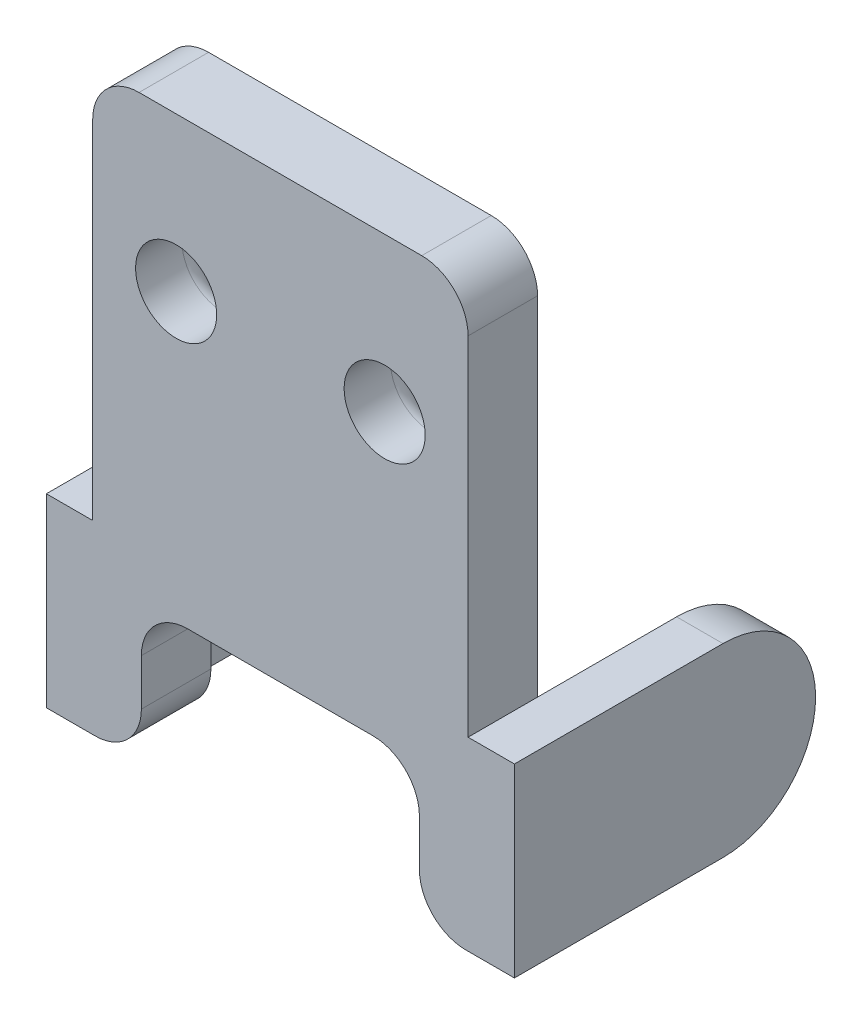
ISO-10303-21;
HEADER;
FILE_DESCRIPTION(('STEP AP214'),'2;1');
FILE_NAME('part.step','',(''),(''),'','','');
FILE_SCHEMA(('AUTOMOTIVE_DESIGN { 1 0 10303 214 1 1 1 1 }'));
ENDSEC;
DATA;
#1=APPLICATION_CONTEXT('core data for automotive mechanical design processes');
#2=APPLICATION_PROTOCOL_DEFINITION('international standard','automotive_design',2000,#1);
#3=PRODUCT_CONTEXT('',#1,'mechanical');
#4=PRODUCT('Part','Part','',(#3));
#5=PRODUCT_RELATED_PRODUCT_CATEGORY('part','',(#4));
#6=PRODUCT_DEFINITION_FORMATION('','',#4);
#7=PRODUCT_DEFINITION_CONTEXT('part definition',#1,'design');
#8=PRODUCT_DEFINITION('design','',#6,#7);
#9=PRODUCT_DEFINITION_SHAPE('','',#8);
#10=(LENGTH_UNIT() NAMED_UNIT(*) SI_UNIT(.MILLI.,.METRE.));
#11=(NAMED_UNIT(*) PLANE_ANGLE_UNIT() SI_UNIT($,.RADIAN.));
#12=(NAMED_UNIT(*) SI_UNIT($,.STERADIAN.) SOLID_ANGLE_UNIT());
#13=UNCERTAINTY_MEASURE_WITH_UNIT(LENGTH_MEASURE(1.E-05),#10,'distance_accuracy_value','');
#14=(GEOMETRIC_REPRESENTATION_CONTEXT(3) GLOBAL_UNCERTAINTY_ASSIGNED_CONTEXT((#13)) GLOBAL_UNIT_ASSIGNED_CONTEXT((#10,
#11,#12)) REPRESENTATION_CONTEXT('',''));
#15=CARTESIAN_POINT('',(0.,0.,0.));
#16=DIRECTION('',(0.,0.,1.));
#17=DIRECTION('',(1.,0.,0.));
#18=AXIS2_PLACEMENT_3D('',#15,#16,#17);
#19=CARTESIAN_POINT('',(0.,0.,3.));
#20=DIRECTION('',(0.,1.,0.));
#21=DIRECTION('',(0.,0.,1.));
#22=AXIS2_PLACEMENT_3D('',#19,#20,#21);
#23=PLANE('',#22);
#24=DIRECTION('',(1.,0.,0.));
#25=VECTOR('',#24,1.);
#26=CARTESIAN_POINT('',(0.,0.,3.));
#27=LINE('',#26,#25);
#28=CARTESIAN_POINT('',(16.1,0.,3.));
#29=VERTEX_POINT('',#28);
#30=CARTESIAN_POINT('',(18.2,0.,3.));
#31=VERTEX_POINT('',#30);
#32=EDGE_CURVE('E189',#29,#31,#27,.T.);
#33=ORIENTED_EDGE('',*,*,#32,.F.);
#34=DIRECTION('',(0.,0.,-1.));
#35=VECTOR('',#34,1.);
#36=CARTESIAN_POINT('',(16.1,0.,3.));
#37=LINE('',#36,#35);
#38=CARTESIAN_POINT('',(16.1,0.,0.));
#39=VERTEX_POINT('',#38);
#40=EDGE_CURVE('E340',#29,#39,#37,.T.);
#41=ORIENTED_EDGE('',*,*,#40,.T.);
#42=DIRECTION('',(1.,0.,0.));
#43=VECTOR('',#42,1.);
#44=CARTESIAN_POINT('',(0.,0.,0.));
#45=LINE('',#44,#43);
#46=CARTESIAN_POINT('',(16.2,0.,0.));
#47=VERTEX_POINT('',#46);
#48=EDGE_CURVE('E261',#39,#47,#45,.T.);
#49=ORIENTED_EDGE('',*,*,#48,.T.);
#50=DIRECTION('',(0.,0.,-1.));
#51=VECTOR('',#50,1.);
#52=CARTESIAN_POINT('',(16.2,0.,3.));
#53=LINE('',#52,#51);
#54=CARTESIAN_POINT('',(16.2,0.,-6.));
#55=VERTEX_POINT('',#54);
#56=EDGE_CURVE('E218',#47,#55,#53,.T.);
#57=ORIENTED_EDGE('',*,*,#56,.T.);
#58=DIRECTION('',(-1.,0.,0.));
#59=VECTOR('',#58,1.);
#60=CARTESIAN_POINT('',(0.,0.,-6.));
#61=LINE('',#60,#59);
#62=CARTESIAN_POINT('',(18.2,0.,-6.));
#63=VERTEX_POINT('',#62);
#64=EDGE_CURVE('E208',#55,#63,#61,.F.);
#65=ORIENTED_EDGE('',*,*,#64,.T.);
#66=DIRECTION('',(0.,0.,-1.));
#67=VECTOR('',#66,1.);
#68=CARTESIAN_POINT('',(18.2,0.,3.));
#69=LINE('',#68,#67);
#70=EDGE_CURVE('E205',#31,#63,#69,.T.);
#71=ORIENTED_EDGE('',*,*,#70,.F.);
#72=EDGE_LOOP('',(#33,#41,#49,#57,#65,#71));
#73=FACE_BOUND('',#72,.T.);
#74=ADVANCED_FACE('F33',(#73),#23,.F.);
#75=CARTESIAN_POINT('',(16.2,0.,3.));
#76=DIRECTION('',(-1.,0.,0.));
#77=DIRECTION('',(0.,0.,1.));
#78=AXIS2_PLACEMENT_3D('',#75,#76,#77);
#79=PLANE('',#78);
#80=DIRECTION('',(0.,1.,0.));
#81=VECTOR('',#80,1.);
#82=CARTESIAN_POINT('',(16.2,0.,0.));
#83=LINE('',#82,#81);
#84=CARTESIAN_POINT('',(16.2,8.,0.));
#85=VERTEX_POINT('',#84);
#86=CARTESIAN_POINT('',(16.2,23.,0.));
#87=VERTEX_POINT('',#86);
#88=EDGE_CURVE('E265',#85,#87,#83,.T.);
#89=ORIENTED_EDGE('',*,*,#88,.T.);
#90=DIRECTION('',(0.,0.,-1.));
#91=VECTOR('',#90,1.);
#92=CARTESIAN_POINT('',(16.2,23.,3.));
#93=LINE('',#92,#91);
#94=CARTESIAN_POINT('',(16.2,23.,3.));
#95=VERTEX_POINT('',#94);
#96=EDGE_CURVE('E11',#87,#95,#93,.F.);
#97=ORIENTED_EDGE('',*,*,#96,.T.);
#98=DIRECTION('',(0.,1.,0.));
#99=VECTOR('',#98,1.);
#100=CARTESIAN_POINT('',(16.2,0.,3.));
#101=LINE('',#100,#99);
#102=CARTESIAN_POINT('',(16.2,8.,3.));
#103=VERTEX_POINT('',#102);
#104=EDGE_CURVE('E254',#103,#95,#101,.T.);
#105=ORIENTED_EDGE('',*,*,#104,.F.);
#106=DIRECTION('',(0.,0.,1.));
#107=VECTOR('',#106,1.);
#108=CARTESIAN_POINT('',(16.2,8.,3.));
#109=LINE('',#108,#107);
#110=EDGE_CURVE('E220',#85,#103,#109,.T.);
#111=ORIENTED_EDGE('',*,*,#110,.F.);
#112=EDGE_LOOP('',(#89,#97,#105,#111));
#113=FACE_BOUND('',#112,.T.);
#114=ADVANCED_FACE('F383',(#113),#79,.F.);
#115=CARTESIAN_POINT('',(0.,0.,3.));
#116=DIRECTION('',(1.,0.,0.));
#117=DIRECTION('',(0.,0.,-1.));
#118=AXIS2_PLACEMENT_3D('',#115,#116,#117);
#119=PLANE('',#118);
#120=DIRECTION('',(0.,-1.,0.));
#121=VECTOR('',#120,1.);
#122=CARTESIAN_POINT('',(0.,0.,3.));
#123=LINE('',#122,#121);
#124=CARTESIAN_POINT('',(0.,23.,3.));
#125=VERTEX_POINT('',#124);
#126=CARTESIAN_POINT('',(0.,8.,3.));
#127=VERTEX_POINT('',#126);
#128=EDGE_CURVE('E202',#125,#127,#123,.T.);
#129=ORIENTED_EDGE('',*,*,#128,.F.);
#130=DIRECTION('',(0.,0.,-1.));
#131=VECTOR('',#130,1.);
#132=CARTESIAN_POINT('',(0.,23.,3.));
#133=LINE('',#132,#131);
#134=CARTESIAN_POINT('',(0.,23.,0.));
#135=VERTEX_POINT('',#134);
#136=EDGE_CURVE('E350',#125,#135,#133,.T.);
#137=ORIENTED_EDGE('',*,*,#136,.T.);
#138=DIRECTION('',(0.,-1.,0.));
#139=VECTOR('',#138,1.);
#140=CARTESIAN_POINT('',(0.,0.,0.));
#141=LINE('',#140,#139);
#142=CARTESIAN_POINT('',(0.,8.,0.));
#143=VERTEX_POINT('',#142);
#144=EDGE_CURVE('E259',#135,#143,#141,.T.);
#145=ORIENTED_EDGE('',*,*,#144,.T.);
#146=DIRECTION('',(0.,0.,-1.));
#147=VECTOR('',#146,1.);
#148=CARTESIAN_POINT('',(0.,8.,3.));
#149=LINE('',#148,#147);
#150=EDGE_CURVE('E244',#127,#143,#149,.T.);
#151=ORIENTED_EDGE('',*,*,#150,.F.);
#152=EDGE_LOOP('',(#129,#137,#145,#151));
#153=FACE_BOUND('',#152,.T.);
#154=ADVANCED_FACE('F369',(#153),#119,.F.);
#155=CARTESIAN_POINT('',(0.,0.,0.));
#156=VERTEX_POINT('',#155);
#157=CARTESIAN_POINT('',(0.0999999999999969,0.,0.));
#158=VERTEX_POINT('',#157);
#159=EDGE_CURVE('E262',#156,#158,#45,.T.);
#160=ORIENTED_EDGE('',*,*,#159,.T.);
#161=DIRECTION('',(0.,0.,-1.));
#162=VECTOR('',#161,1.);
#163=CARTESIAN_POINT('',(0.0999999999999969,0.,3.));
#164=LINE('',#163,#162);
#165=CARTESIAN_POINT('',(0.0999999999999969,0.,3.));
#166=VERTEX_POINT('',#165);
#167=EDGE_CURVE('E325',#158,#166,#164,.F.);
#168=ORIENTED_EDGE('',*,*,#167,.T.);
#169=CARTESIAN_POINT('',(-2.,0.,3.));
#170=VERTEX_POINT('',#169);
#171=EDGE_CURVE('E201',#170,#166,#27,.T.);
#172=ORIENTED_EDGE('',*,*,#171,.F.);
#173=DIRECTION('',(0.,0.,1.));
#174=VECTOR('',#173,1.);
#175=CARTESIAN_POINT('',(-2.,0.,3.));
#176=LINE('',#175,#174);
#177=CARTESIAN_POINT('',(-2.,0.,-6.));
#178=VERTEX_POINT('',#177);
#179=EDGE_CURVE('E241',#178,#170,#176,.T.);
#180=ORIENTED_EDGE('',*,*,#179,.F.);
#181=DIRECTION('',(1.,0.,0.));
#182=VECTOR('',#181,1.);
#183=CARTESIAN_POINT('',(0.,0.,-6.));
#184=LINE('',#183,#182);
#185=CARTESIAN_POINT('',(0.,0.,-6.));
#186=VERTEX_POINT('',#185);
#187=EDGE_CURVE('E295',#178,#186,#184,.T.);
#188=ORIENTED_EDGE('',*,*,#187,.T.);
#189=DIRECTION('',(0.,0.,1.));
#190=VECTOR('',#189,1.);
#191=CARTESIAN_POINT('',(0.,0.,3.));
#192=LINE('',#191,#190);
#193=EDGE_CURVE('E238',#186,#156,#192,.T.);
#194=ORIENTED_EDGE('',*,*,#193,.T.);
#195=EDGE_LOOP('',(#160,#168,#172,#180,#188,#194));
#196=FACE_BOUND('',#195,.T.);
#197=ADVANCED_FACE('F441',(#196),#23,.F.);
#198=CARTESIAN_POINT('',(0.,25.,3.));
#199=DIRECTION('',(0.,-1.,0.));
#200=DIRECTION('',(0.,0.,-1.));
#201=AXIS2_PLACEMENT_3D('',#198,#199,#200);
#202=PLANE('',#201);
#203=DIRECTION('',(-1.,0.,0.));
#204=VECTOR('',#203,1.);
#205=CARTESIAN_POINT('',(0.,25.,0.));
#206=LINE('',#205,#204);
#207=CARTESIAN_POINT('',(14.2,25.,0.));
#208=VERTEX_POINT('',#207);
#209=CARTESIAN_POINT('',(2.,25.,0.));
#210=VERTEX_POINT('',#209);
#211=EDGE_CURVE('E251',#208,#210,#206,.T.);
#212=ORIENTED_EDGE('',*,*,#211,.T.);
#213=DIRECTION('',(0.,0.,-1.));
#214=VECTOR('',#213,1.);
#215=CARTESIAN_POINT('',(2.,25.,3.));
#216=LINE('',#215,#214);
#217=CARTESIAN_POINT('',(2.,25.,3.));
#218=VERTEX_POINT('',#217);
#219=EDGE_CURVE('E54',#210,#218,#216,.F.);
#220=ORIENTED_EDGE('',*,*,#219,.T.);
#221=DIRECTION('',(-1.,0.,0.));
#222=VECTOR('',#221,1.);
#223=CARTESIAN_POINT('',(0.,25.,3.));
#224=LINE('',#223,#222);
#225=CARTESIAN_POINT('',(14.2,25.,3.));
#226=VERTEX_POINT('',#225);
#227=EDGE_CURVE('E256',#226,#218,#224,.T.);
#228=ORIENTED_EDGE('',*,*,#227,.F.);
#229=DIRECTION('',(0.,0.,-1.));
#230=VECTOR('',#229,1.);
#231=CARTESIAN_POINT('',(14.2,25.,3.));
#232=LINE('',#231,#230);
#233=EDGE_CURVE('E357',#226,#208,#232,.T.);
#234=ORIENTED_EDGE('',*,*,#233,.T.);
#235=EDGE_LOOP('',(#212,#220,#228,#234));
#236=FACE_BOUND('',#235,.T.);
#237=ADVANCED_FACE('F376',(#236),#202,.F.);
#238=CARTESIAN_POINT('',(0.,0.,3.));
#239=DIRECTION('',(0.,0.,-1.));
#240=DIRECTION('',(-1.,0.,0.));
#241=AXIS2_PLACEMENT_3D('',#238,#239,#240);
#242=PLANE('',#241);
#243=CARTESIAN_POINT('',(3.6,18.360124913352,3.));
#244=DIRECTION('',(0.,0.,-1.));
#245=DIRECTION('',(-1.,0.,0.));
#246=AXIS2_PLACEMENT_3D('',#243,#244,#245);
#247=CIRCLE('',#246,1.75);
#248=CARTESIAN_POINT('',(1.85,18.360124913352,3.));
#249=VERTEX_POINT('',#248);
#250=EDGE_CURVE('E313',#249,#249,#247,.F.);
#251=ORIENTED_EDGE('',*,*,#250,.F.);
#252=EDGE_LOOP('',(#251));
#253=FACE_BOUND('',#252,.T.);
#254=CARTESIAN_POINT('',(12.6,18.360124913352,3.));
#255=DIRECTION('',(0.,0.,-1.));
#256=DIRECTION('',(-1.,0.,0.));
#257=AXIS2_PLACEMENT_3D('',#254,#255,#256);
#258=CIRCLE('',#257,1.75);
#259=CARTESIAN_POINT('',(10.85,18.360124913352,3.));
#260=VERTEX_POINT('',#259);
#261=EDGE_CURVE('E471',#260,#260,#258,.F.);
#262=ORIENTED_EDGE('',*,*,#261,.F.);
#263=EDGE_LOOP('',(#262));
#264=FACE_BOUND('',#263,.T.);
#265=ORIENTED_EDGE('',*,*,#227,.T.);
#266=CARTESIAN_POINT('',(2.,23.,3.));
#267=DIRECTION('',(0.,0.,-1.));
#268=DIRECTION('',(-1.,0.,0.));
#269=AXIS2_PLACEMENT_3D('',#266,#267,#268);
#270=CIRCLE('',#269,2.);
#271=EDGE_CURVE('E41',#218,#125,#270,.F.);
#272=ORIENTED_EDGE('',*,*,#271,.T.);
#273=ORIENTED_EDGE('',*,*,#128,.T.);
#274=DIRECTION('',(1.,0.,0.));
#275=VECTOR('',#274,1.);
#276=CARTESIAN_POINT('',(-2.,8.,3.));
#277=LINE('',#276,#275);
#278=CARTESIAN_POINT('',(-2.,8.,3.));
#279=VERTEX_POINT('',#278);
#280=EDGE_CURVE('E243',#279,#127,#277,.T.);
#281=ORIENTED_EDGE('',*,*,#280,.F.);
#282=DIRECTION('',(0.,1.,0.));
#283=VECTOR('',#282,1.);
#284=CARTESIAN_POINT('',(-2.,0.,3.));
#285=LINE('',#284,#283);
#286=EDGE_CURVE('E234',#170,#279,#285,.T.);
#287=ORIENTED_EDGE('',*,*,#286,.F.);
#288=ORIENTED_EDGE('',*,*,#171,.T.);
#289=CARTESIAN_POINT('',(0.0999999999999969,2.,3.));
#290=DIRECTION('',(0.,0.,-1.));
#291=DIRECTION('',(-1.,0.,0.));
#292=AXIS2_PLACEMENT_3D('',#289,#290,#291);
#293=CIRCLE('',#292,2.);
#294=CARTESIAN_POINT('',(2.1,2.,3.));
#295=VERTEX_POINT('',#294);
#296=EDGE_CURVE('E328',#166,#295,#293,.F.);
#297=ORIENTED_EDGE('',*,*,#296,.T.);
#298=DIRECTION('',(0.,-1.,0.));
#299=VECTOR('',#298,1.);
#300=CARTESIAN_POINT('',(2.1,0.,3.));
#301=LINE('',#300,#299);
#302=CARTESIAN_POINT('',(2.09999999999999,4.,3.));
#303=VERTEX_POINT('',#302);
#304=EDGE_CURVE('E412',#303,#295,#301,.T.);
#305=ORIENTED_EDGE('',*,*,#304,.F.);
#306=CARTESIAN_POINT('',(4.1,4.,3.));
#307=DIRECTION('',(0.,0.,-1.));
#308=DIRECTION('',(-1.,0.,0.));
#309=AXIS2_PLACEMENT_3D('',#306,#307,#308);
#310=CIRCLE('',#309,2.);
#311=CARTESIAN_POINT('',(4.1,6.,3.));
#312=VERTEX_POINT('',#311);
#313=EDGE_CURVE('E344',#303,#312,#310,.T.);
#314=ORIENTED_EDGE('',*,*,#313,.T.);
#315=DIRECTION('',(-1.,0.,0.));
#316=VECTOR('',#315,1.);
#317=CARTESIAN_POINT('',(14.1,6.,3.));
#318=LINE('',#317,#316);
#319=CARTESIAN_POINT('',(12.1,6.,3.));
#320=VERTEX_POINT('',#319);
#321=EDGE_CURVE('E407',#320,#312,#318,.T.);
#322=ORIENTED_EDGE('',*,*,#321,.F.);
#323=CARTESIAN_POINT('',(12.1,4.,3.));
#324=DIRECTION('',(0.,0.,-1.));
#325=DIRECTION('',(-1.,0.,0.));
#326=AXIS2_PLACEMENT_3D('',#323,#324,#325);
#327=CIRCLE('',#326,2.);
#328=CARTESIAN_POINT('',(14.1,4.,3.));
#329=VERTEX_POINT('',#328);
#330=EDGE_CURVE('E348',#320,#329,#327,.T.);
#331=ORIENTED_EDGE('',*,*,#330,.T.);
#332=DIRECTION('',(0.,1.,0.));
#333=VECTOR('',#332,1.);
#334=CARTESIAN_POINT('',(14.1,0.,3.));
#335=LINE('',#334,#333);
#336=CARTESIAN_POINT('',(14.1,2.,3.));
#337=VERTEX_POINT('',#336);
#338=EDGE_CURVE('E402',#337,#329,#335,.T.);
#339=ORIENTED_EDGE('',*,*,#338,.F.);
#340=CARTESIAN_POINT('',(16.1,2.,3.));
#341=DIRECTION('',(0.,0.,-1.));
#342=DIRECTION('',(-1.,0.,0.));
#343=AXIS2_PLACEMENT_3D('',#340,#341,#342);
#344=CIRCLE('',#343,2.);
#345=EDGE_CURVE('E197',#337,#29,#344,.F.);
#346=ORIENTED_EDGE('',*,*,#345,.T.);
#347=ORIENTED_EDGE('',*,*,#32,.T.);
#348=DIRECTION('',(0.,-1.,0.));
#349=VECTOR('',#348,1.);
#350=CARTESIAN_POINT('',(18.2,0.,3.));
#351=LINE('',#350,#349);
#352=CARTESIAN_POINT('',(18.2,8.,3.));
#353=VERTEX_POINT('',#352);
#354=EDGE_CURVE('E194',#353,#31,#351,.T.);
#355=ORIENTED_EDGE('',*,*,#354,.F.);
#356=DIRECTION('',(-1.,0.,0.));
#357=VECTOR('',#356,1.);
#358=CARTESIAN_POINT('',(18.2,8.,3.));
#359=LINE('',#358,#357);
#360=EDGE_CURVE('E226',#353,#103,#359,.T.);
#361=ORIENTED_EDGE('',*,*,#360,.T.);
#362=ORIENTED_EDGE('',*,*,#104,.T.);
#363=CARTESIAN_POINT('',(14.2,23.,3.));
#364=DIRECTION('',(0.,0.,-1.));
#365=DIRECTION('',(-1.,0.,0.));
#366=AXIS2_PLACEMENT_3D('',#363,#364,#365);
#367=CIRCLE('',#366,2.);
#368=EDGE_CURVE('E361',#95,#226,#367,.F.);
#369=ORIENTED_EDGE('',*,*,#368,.T.);
#370=EDGE_LOOP('',(#265,#272,#273,#281,#287,#288,#297,#305,#314,#322,#331,#339,#346,#347,#355,
#361,#362,#369));
#371=FACE_BOUND('',#370,.T.);
#372=ADVANCED_FACE('F191',(#253,#264,#371),#242,.F.);
#373=CARTESIAN_POINT('',(0.,0.,0.));
#374=DIRECTION('',(0.,0.,-1.));
#375=DIRECTION('',(-1.,0.,0.));
#376=AXIS2_PLACEMENT_3D('',#373,#374,#375);
#377=PLANE('',#376);
#378=CARTESIAN_POINT('',(3.6,18.360124913352,0.));
#379=DIRECTION('',(0.,0.,-1.));
#380=DIRECTION('',(-1.,0.,0.));
#381=AXIS2_PLACEMENT_3D('',#378,#379,#380);
#382=CIRCLE('',#381,2.75);
#383=CARTESIAN_POINT('',(0.849999999999998,18.360124913352,0.));
#384=VERTEX_POINT('',#383);
#385=EDGE_CURVE('E278',#384,#384,#382,.F.);
#386=ORIENTED_EDGE('',*,*,#385,.T.);
#387=EDGE_LOOP('',(#386));
#388=FACE_BOUND('',#387,.T.);
#389=CARTESIAN_POINT('',(12.6,18.360124913352,0.));
#390=DIRECTION('',(0.,0.,-1.));
#391=DIRECTION('',(-1.,0.,0.));
#392=AXIS2_PLACEMENT_3D('',#389,#390,#391);
#393=CIRCLE('',#392,2.75);
#394=CARTESIAN_POINT('',(9.85,18.360124913352,0.));
#395=VERTEX_POINT('',#394);
#396=EDGE_CURVE('E275',#395,#395,#393,.F.);
#397=ORIENTED_EDGE('',*,*,#396,.T.);
#398=EDGE_LOOP('',(#397));
#399=FACE_BOUND('',#398,.T.);
#400=ORIENTED_EDGE('',*,*,#144,.F.);
#401=CARTESIAN_POINT('',(2.,23.,0.));
#402=DIRECTION('',(0.,0.,-1.));
#403=DIRECTION('',(-1.,0.,0.));
#404=AXIS2_PLACEMENT_3D('',#401,#402,#403);
#405=CIRCLE('',#404,2.);
#406=EDGE_CURVE('E355',#135,#210,#405,.T.);
#407=ORIENTED_EDGE('',*,*,#406,.T.);
#408=ORIENTED_EDGE('',*,*,#211,.F.);
#409=CARTESIAN_POINT('',(14.2,23.,0.));
#410=DIRECTION('',(0.,0.,-1.));
#411=DIRECTION('',(-1.,0.,0.));
#412=AXIS2_PLACEMENT_3D('',#409,#410,#411);
#413=CIRCLE('',#412,2.);
#414=EDGE_CURVE('E353',#208,#87,#413,.T.);
#415=ORIENTED_EDGE('',*,*,#414,.T.);
#416=ORIENTED_EDGE('',*,*,#88,.F.);
#417=EDGE_CURVE('E266',#47,#85,#83,.T.);
#418=ORIENTED_EDGE('',*,*,#417,.F.);
#419=ORIENTED_EDGE('',*,*,#48,.F.);
#420=CARTESIAN_POINT('',(16.1,2.,0.));
#421=DIRECTION('',(0.,0.,-1.));
#422=DIRECTION('',(-1.,0.,0.));
#423=AXIS2_PLACEMENT_3D('',#420,#421,#422);
#424=CIRCLE('',#423,2.);
#425=CARTESIAN_POINT('',(14.1,2.,0.));
#426=VERTEX_POINT('',#425);
#427=EDGE_CURVE('E321',#39,#426,#424,.T.);
#428=ORIENTED_EDGE('',*,*,#427,.T.);
#429=DIRECTION('',(0.,-1.,0.));
#430=VECTOR('',#429,1.);
#431=CARTESIAN_POINT('',(14.1,0.,0.));
#432=LINE('',#431,#430);
#433=CARTESIAN_POINT('',(14.1,4.,0.));
#434=VERTEX_POINT('',#433);
#435=EDGE_CURVE('E404',#434,#426,#432,.T.);
#436=ORIENTED_EDGE('',*,*,#435,.F.);
#437=CARTESIAN_POINT('',(12.1,4.,0.));
#438=DIRECTION('',(0.,0.,-1.));
#439=DIRECTION('',(-1.,0.,0.));
#440=AXIS2_PLACEMENT_3D('',#437,#438,#439);
#441=CIRCLE('',#440,2.);
#442=CARTESIAN_POINT('',(12.1,6.,0.));
#443=VERTEX_POINT('',#442);
#444=EDGE_CURVE('E346',#434,#443,#441,.F.);
#445=ORIENTED_EDGE('',*,*,#444,.T.);
#446=DIRECTION('',(1.,0.,0.));
#447=VECTOR('',#446,1.);
#448=CARTESIAN_POINT('',(14.1,6.,0.));
#449=LINE('',#448,#447);
#450=CARTESIAN_POINT('',(4.1,6.,0.));
#451=VERTEX_POINT('',#450);
#452=EDGE_CURVE('E418',#451,#443,#449,.T.);
#453=ORIENTED_EDGE('',*,*,#452,.F.);
#454=CARTESIAN_POINT('',(4.1,4.,0.));
#455=DIRECTION('',(0.,0.,-1.));
#456=DIRECTION('',(-1.,0.,0.));
#457=AXIS2_PLACEMENT_3D('',#454,#455,#456);
#458=CIRCLE('',#457,2.);
#459=CARTESIAN_POINT('',(2.09999999999999,4.,0.));
#460=VERTEX_POINT('',#459);
#461=EDGE_CURVE('E342',#451,#460,#458,.F.);
#462=ORIENTED_EDGE('',*,*,#461,.T.);
#463=DIRECTION('',(0.,1.,0.));
#464=VECTOR('',#463,1.);
#465=CARTESIAN_POINT('',(2.1,0.,0.));
#466=LINE('',#465,#464);
#467=CARTESIAN_POINT('',(2.1,2.,0.));
#468=VERTEX_POINT('',#467);
#469=EDGE_CURVE('E409',#468,#460,#466,.T.);
#470=ORIENTED_EDGE('',*,*,#469,.F.);
#471=CARTESIAN_POINT('',(0.0999999999999969,2.,0.));
#472=DIRECTION('',(0.,0.,-1.));
#473=DIRECTION('',(-1.,0.,0.));
#474=AXIS2_PLACEMENT_3D('',#471,#472,#473);
#475=CIRCLE('',#474,2.);
#476=EDGE_CURVE('E323',#468,#158,#475,.T.);
#477=ORIENTED_EDGE('',*,*,#476,.T.);
#478=ORIENTED_EDGE('',*,*,#159,.F.);
#479=EDGE_CURVE('E250',#143,#156,#141,.T.);
#480=ORIENTED_EDGE('',*,*,#479,.F.);
#481=EDGE_LOOP('',(#400,#407,#408,#415,#416,#418,#419,#428,#436,#445,#453,#462,#470,#477,#478,#480));
#482=FACE_BOUND('',#481,.T.);
#483=ADVANCED_FACE('F374',(#388,#399,#482),#377,.T.);
#484=CARTESIAN_POINT('',(0.,0.,0.));
#485=DIRECTION('',(-1.,0.,0.));
#486=DIRECTION('',(0.,0.,1.));
#487=AXIS2_PLACEMENT_3D('',#484,#485,#486);
#488=PLANE('',#487);
#489=CARTESIAN_POINT('',(0.,4.03577497147012,-7.));
#490=DIRECTION('',(-1.,0.,0.));
#491=DIRECTION('',(0.,0.,1.));
#492=AXIS2_PLACEMENT_3D('',#489,#490,#491);
#493=CIRCLE('',#492,1.8);
#494=CARTESIAN_POINT('',(0.,4.03577497147012,-5.2));
#495=VERTEX_POINT('',#494);
#496=EDGE_CURVE('E258',#495,#495,#493,.F.);
#497=ORIENTED_EDGE('',*,*,#496,.F.);
#498=EDGE_LOOP('',(#497));
#499=FACE_BOUND('',#498,.T.);
#500=CARTESIAN_POINT('',(0.,4.,-6.));
#501=DIRECTION('',(-1.,0.,0.));
#502=DIRECTION('',(0.,0.,1.));
#503=AXIS2_PLACEMENT_3D('',#500,#501,#502);
#504=CIRCLE('',#503,4.);
#505=CARTESIAN_POINT('',(0.,4.,-10.));
#506=VERTEX_POINT('',#505);
#507=EDGE_CURVE('E284',#186,#506,#504,.F.);
#508=ORIENTED_EDGE('',*,*,#507,.T.);
#509=CARTESIAN_POINT('',(0.,4.,-6.));
#510=DIRECTION('',(-1.,0.,0.));
#511=DIRECTION('',(0.,0.,1.));
#512=AXIS2_PLACEMENT_3D('',#509,#510,#511);
#513=CIRCLE('',#512,4.);
#514=CARTESIAN_POINT('',(0.,8.,-6.));
#515=VERTEX_POINT('',#514);
#516=EDGE_CURVE('E286',#506,#515,#513,.F.);
#517=ORIENTED_EDGE('',*,*,#516,.T.);
#518=EDGE_CURVE('E233',#143,#515,#149,.T.);
#519=ORIENTED_EDGE('',*,*,#518,.F.);
#520=ORIENTED_EDGE('',*,*,#479,.T.);
#521=ORIENTED_EDGE('',*,*,#193,.F.);
#522=EDGE_LOOP('',(#508,#517,#519,#520,#521));
#523=FACE_BOUND('',#522,.T.);
#524=ADVANCED_FACE('F603',(#499,#523),#488,.F.);
#525=CARTESIAN_POINT('',(-2.,8.,3.));
#526=DIRECTION('',(0.,-1.,0.));
#527=DIRECTION('',(0.,0.,-1.));
#528=AXIS2_PLACEMENT_3D('',#525,#526,#527);
#529=PLANE('',#528);
#530=ORIENTED_EDGE('',*,*,#518,.T.);
#531=DIRECTION('',(1.,0.,0.));
#532=VECTOR('',#531,1.);
#533=CARTESIAN_POINT('',(-2.,8.,-6.));
#534=LINE('',#533,#532);
#535=CARTESIAN_POINT('',(-2.,8.,-6.));
#536=VERTEX_POINT('',#535);
#537=EDGE_CURVE('E288',#515,#536,#534,.F.);
#538=ORIENTED_EDGE('',*,*,#537,.T.);
#539=DIRECTION('',(0.,0.,-1.));
#540=VECTOR('',#539,1.);
#541=CARTESIAN_POINT('',(-2.,8.,3.));
#542=LINE('',#541,#540);
#543=EDGE_CURVE('E237',#279,#536,#542,.T.);
#544=ORIENTED_EDGE('',*,*,#543,.F.);
#545=ORIENTED_EDGE('',*,*,#280,.T.);
#546=ORIENTED_EDGE('',*,*,#150,.T.);
#547=EDGE_LOOP('',(#530,#538,#544,#545,#546));
#548=FACE_BOUND('',#547,.T.);
#549=ADVANCED_FACE('F697',(#548),#529,.F.);
#550=CARTESIAN_POINT('',(-2.,0.,0.));
#551=DIRECTION('',(-1.,0.,0.));
#552=DIRECTION('',(0.,0.,1.));
#553=AXIS2_PLACEMENT_3D('',#550,#551,#552);
#554=PLANE('',#553);
#555=ORIENTED_EDGE('',*,*,#543,.T.);
#556=CARTESIAN_POINT('',(-2.,4.,-6.));
#557=DIRECTION('',(-1.,0.,0.));
#558=DIRECTION('',(0.,0.,1.));
#559=AXIS2_PLACEMENT_3D('',#556,#557,#558);
#560=CIRCLE('',#559,4.);
#561=CARTESIAN_POINT('',(-2.,4.,-10.));
#562=VERTEX_POINT('',#561);
#563=EDGE_CURVE('E293',#536,#562,#560,.T.);
#564=ORIENTED_EDGE('',*,*,#563,.T.);
#565=CARTESIAN_POINT('',(-2.,4.,-6.));
#566=DIRECTION('',(-1.,0.,0.));
#567=DIRECTION('',(0.,0.,1.));
#568=AXIS2_PLACEMENT_3D('',#565,#566,#567);
#569=CIRCLE('',#568,4.);
#570=EDGE_CURVE('E291',#562,#178,#569,.T.);
#571=ORIENTED_EDGE('',*,*,#570,.T.);
#572=ORIENTED_EDGE('',*,*,#179,.T.);
#573=ORIENTED_EDGE('',*,*,#286,.T.);
#574=EDGE_LOOP('',(#555,#564,#571,#572,#573));
#575=FACE_BOUND('',#574,.T.);
#576=ADVANCED_FACE('F706',(#575),#554,.T.);
#577=CARTESIAN_POINT('',(1.5,4.03577497147012,-7.));
#578=DIRECTION('',(-1.,0.,0.));
#579=DIRECTION('',(0.,0.,1.));
#580=AXIS2_PLACEMENT_3D('',#577,#578,#579);
#581=CYLINDRICAL_SURFACE('',#580,1.8);
#582=CARTESIAN_POINT('',(1.5,4.03577497147012,-7.));
#583=DIRECTION('',(1.,0.,0.));
#584=DIRECTION('',(0.,0.,-1.));
#585=AXIS2_PLACEMENT_3D('',#582,#583,#584);
#586=CIRCLE('',#585,1.8);
#587=CARTESIAN_POINT('',(1.5,4.03577497147012,-8.8));
#588=VERTEX_POINT('',#587);
#589=EDGE_CURVE('E230',#588,#588,#586,.T.);
#590=ORIENTED_EDGE('',*,*,#589,.F.);
#591=EDGE_LOOP('',(#590));
#592=FACE_BOUND('',#591,.T.);
#593=ORIENTED_EDGE('',*,*,#496,.T.);
#594=EDGE_LOOP('',(#593));
#595=FACE_BOUND('',#594,.T.);
#596=ADVANCED_FACE('F715',(#592,#595),#581,.T.);
#597=CARTESIAN_POINT('',(1.5,4.03577497147012,-7.));
#598=DIRECTION('',(1.,0.,0.));
#599=DIRECTION('',(0.,0.,-1.));
#600=AXIS2_PLACEMENT_3D('',#597,#598,#599);
#601=PLANE('',#600);
#602=ORIENTED_EDGE('',*,*,#589,.T.);
#603=EDGE_LOOP('',(#602));
#604=FACE_BOUND('',#603,.T.);
#605=ADVANCED_FACE('F724',(#604),#601,.T.);
#606=CARTESIAN_POINT('',(18.2,8.,3.));
#607=DIRECTION('',(0.,-1.,0.));
#608=DIRECTION('',(0.,0.,-1.));
#609=AXIS2_PLACEMENT_3D('',#606,#607,#608);
#610=PLANE('',#609);
#611=DIRECTION('',(0.,0.,1.));
#612=VECTOR('',#611,1.);
#613=CARTESIAN_POINT('',(18.2,8.,3.));
#614=LINE('',#613,#612);
#615=CARTESIAN_POINT('',(18.2,8.,-6.));
#616=VERTEX_POINT('',#615);
#617=EDGE_CURVE('E211',#616,#353,#614,.T.);
#618=ORIENTED_EDGE('',*,*,#617,.F.);
#619=DIRECTION('',(-1.,0.,0.));
#620=VECTOR('',#619,1.);
#621=CARTESIAN_POINT('',(18.2,8.,-6.));
#622=LINE('',#621,#620);
#623=CARTESIAN_POINT('',(16.2,8.,-6.));
#624=VERTEX_POINT('',#623);
#625=EDGE_CURVE('E297',#616,#624,#622,.T.);
#626=ORIENTED_EDGE('',*,*,#625,.T.);
#627=EDGE_CURVE('E216',#624,#85,#109,.T.);
#628=ORIENTED_EDGE('',*,*,#627,.T.);
#629=ORIENTED_EDGE('',*,*,#110,.T.);
#630=ORIENTED_EDGE('',*,*,#360,.F.);
#631=EDGE_LOOP('',(#618,#626,#628,#629,#630));
#632=FACE_BOUND('',#631,.T.);
#633=ADVANCED_FACE('F386',(#632),#610,.F.);
#634=CARTESIAN_POINT('',(18.2,0.,0.));
#635=DIRECTION('',(-1.,0.,0.));
#636=DIRECTION('',(0.,0.,1.));
#637=AXIS2_PLACEMENT_3D('',#634,#635,#636);
#638=PLANE('',#637);
#639=CARTESIAN_POINT('',(18.2,4.,-6.));
#640=DIRECTION('',(-1.,0.,0.));
#641=DIRECTION('',(0.,0.,1.));
#642=AXIS2_PLACEMENT_3D('',#639,#640,#641);
#643=CIRCLE('',#642,4.);
#644=CARTESIAN_POINT('',(18.2,4.,-10.));
#645=VERTEX_POINT('',#644);
#646=EDGE_CURVE('E304',#63,#645,#643,.F.);
#647=ORIENTED_EDGE('',*,*,#646,.T.);
#648=CARTESIAN_POINT('',(18.2,4.,-6.));
#649=DIRECTION('',(-1.,0.,0.));
#650=DIRECTION('',(0.,0.,1.));
#651=AXIS2_PLACEMENT_3D('',#648,#649,#650);
#652=CIRCLE('',#651,4.);
#653=EDGE_CURVE('E306',#645,#616,#652,.F.);
#654=ORIENTED_EDGE('',*,*,#653,.T.);
#655=ORIENTED_EDGE('',*,*,#617,.T.);
#656=ORIENTED_EDGE('',*,*,#354,.T.);
#657=ORIENTED_EDGE('',*,*,#70,.T.);
#658=EDGE_LOOP('',(#647,#654,#655,#656,#657));
#659=FACE_BOUND('',#658,.T.);
#660=ADVANCED_FACE('F213',(#659),#638,.F.);
#661=CARTESIAN_POINT('',(16.2,0.,0.));
#662=DIRECTION('',(-1.,0.,0.));
#663=DIRECTION('',(0.,0.,1.));
#664=AXIS2_PLACEMENT_3D('',#661,#662,#663);
#665=PLANE('',#664);
#666=CARTESIAN_POINT('',(16.2,3.87973122911944,-7.));
#667=DIRECTION('',(-1.,0.,0.));
#668=DIRECTION('',(0.,0.,1.));
#669=AXIS2_PLACEMENT_3D('',#666,#667,#668);
#670=CIRCLE('',#669,1.8);
#671=CARTESIAN_POINT('',(16.2,3.87973122911944,-5.2));
#672=VERTEX_POINT('',#671);
#673=EDGE_CURVE('E222',#672,#672,#670,.T.);
#674=ORIENTED_EDGE('',*,*,#673,.F.);
#675=EDGE_LOOP('',(#674));
#676=FACE_BOUND('',#675,.T.);
#677=ORIENTED_EDGE('',*,*,#627,.F.);
#678=CARTESIAN_POINT('',(16.2,4.,-6.));
#679=DIRECTION('',(-1.,0.,0.));
#680=DIRECTION('',(0.,0.,1.));
#681=AXIS2_PLACEMENT_3D('',#678,#679,#680);
#682=CIRCLE('',#681,4.);
#683=CARTESIAN_POINT('',(16.2,4.,-10.));
#684=VERTEX_POINT('',#683);
#685=EDGE_CURVE('E302',#624,#684,#682,.T.);
#686=ORIENTED_EDGE('',*,*,#685,.T.);
#687=CARTESIAN_POINT('',(16.2,4.,-6.));
#688=DIRECTION('',(-1.,0.,0.));
#689=DIRECTION('',(0.,0.,1.));
#690=AXIS2_PLACEMENT_3D('',#687,#688,#689);
#691=CIRCLE('',#690,4.);
#692=EDGE_CURVE('E300',#684,#55,#691,.T.);
#693=ORIENTED_EDGE('',*,*,#692,.T.);
#694=ORIENTED_EDGE('',*,*,#56,.F.);
#695=ORIENTED_EDGE('',*,*,#417,.T.);
#696=EDGE_LOOP('',(#677,#686,#693,#694,#695));
#697=FACE_BOUND('',#696,.T.);
#698=ADVANCED_FACE('F390',(#676,#697),#665,.T.);
#699=CARTESIAN_POINT('',(14.7,3.87973122911944,-7.));
#700=DIRECTION('',(1.,0.,0.));
#701=DIRECTION('',(0.,0.,-1.));
#702=AXIS2_PLACEMENT_3D('',#699,#700,#701);
#703=CYLINDRICAL_SURFACE('',#702,1.8);
#704=CARTESIAN_POINT('',(14.7,3.87973122911944,-7.));
#705=DIRECTION('',(-1.,0.,0.));
#706=DIRECTION('',(0.,0.,1.));
#707=AXIS2_PLACEMENT_3D('',#704,#705,#706);
#708=CIRCLE('',#707,1.8);
#709=CARTESIAN_POINT('',(14.7,3.87973122911944,-5.2));
#710=VERTEX_POINT('',#709);
#711=EDGE_CURVE('E227',#710,#710,#708,.T.);
#712=ORIENTED_EDGE('',*,*,#711,.F.);
#713=EDGE_LOOP('',(#712));
#714=FACE_BOUND('',#713,.T.);
#715=ORIENTED_EDGE('',*,*,#673,.T.);
#716=EDGE_LOOP('',(#715));
#717=FACE_BOUND('',#716,.T.);
#718=ADVANCED_FACE('F426',(#714,#717),#703,.T.);
#719=CARTESIAN_POINT('',(14.7,3.87973122911944,-7.));
#720=DIRECTION('',(-1.,0.,0.));
#721=DIRECTION('',(0.,0.,1.));
#722=AXIS2_PLACEMENT_3D('',#719,#720,#721);
#723=PLANE('',#722);
#724=ORIENTED_EDGE('',*,*,#711,.T.);
#725=EDGE_LOOP('',(#724));
#726=FACE_BOUND('',#725,.T.);
#727=ADVANCED_FACE('F434',(#726),#723,.T.);
#728=CARTESIAN_POINT('',(14.1,0.,3.001));
#729=DIRECTION('',(1.,0.,0.));
#730=DIRECTION('',(0.,1.,0.));
#731=AXIS2_PLACEMENT_3D('',#728,#729,#730);
#732=PLANE('',#731);
#733=ORIENTED_EDGE('',*,*,#338,.T.);
#734=DIRECTION('',(0.,0.,-1.));
#735=VECTOR('',#734,1.);
#736=CARTESIAN_POINT('',(14.1,4.,0.));
#737=LINE('',#736,#735);
#738=EDGE_CURVE('E337',#329,#434,#737,.T.);
#739=ORIENTED_EDGE('',*,*,#738,.T.);
#740=ORIENTED_EDGE('',*,*,#435,.T.);
#741=DIRECTION('',(0.,0.,-1.));
#742=VECTOR('',#741,1.);
#743=CARTESIAN_POINT('',(14.1,2.,3.001));
#744=LINE('',#743,#742);
#745=EDGE_CURVE('E335',#426,#337,#744,.F.);
#746=ORIENTED_EDGE('',*,*,#745,.T.);
#747=EDGE_LOOP('',(#733,#739,#740,#746));
#748=FACE_BOUND('',#747,.T.);
#749=ADVANCED_FACE('F401',(#748),#732,.F.);
#750=CARTESIAN_POINT('',(14.1,6.,3.001));
#751=DIRECTION('',(0.,1.,0.));
#752=DIRECTION('',(0.,0.,1.));
#753=AXIS2_PLACEMENT_3D('',#750,#751,#752);
#754=PLANE('',#753);
#755=ORIENTED_EDGE('',*,*,#321,.T.);
#756=DIRECTION('',(0.,0.,-1.));
#757=VECTOR('',#756,1.);
#758=CARTESIAN_POINT('',(4.1,6.,0.));
#759=LINE('',#758,#757);
#760=EDGE_CURVE('E332',#312,#451,#759,.T.);
#761=ORIENTED_EDGE('',*,*,#760,.T.);
#762=ORIENTED_EDGE('',*,*,#452,.T.);
#763=DIRECTION('',(0.,0.,-1.));
#764=VECTOR('',#763,1.);
#765=CARTESIAN_POINT('',(12.1,6.,3.));
#766=LINE('',#765,#764);
#767=EDGE_CURVE('E330',#443,#320,#766,.F.);
#768=ORIENTED_EDGE('',*,*,#767,.T.);
#769=EDGE_LOOP('',(#755,#761,#762,#768));
#770=FACE_BOUND('',#769,.T.);
#771=ADVANCED_FACE('F496',(#770),#754,.F.);
#772=CARTESIAN_POINT('',(2.1,0.,3.001));
#773=DIRECTION('',(-1.,0.,0.));
#774=DIRECTION('',(0.,-1.,0.));
#775=AXIS2_PLACEMENT_3D('',#772,#773,#774);
#776=PLANE('',#775);
#777=ORIENTED_EDGE('',*,*,#304,.T.);
#778=DIRECTION('',(0.,0.,-1.));
#779=VECTOR('',#778,1.);
#780=CARTESIAN_POINT('',(2.1,2.,3.001));
#781=LINE('',#780,#779);
#782=EDGE_CURVE('E318',#295,#468,#781,.T.);
#783=ORIENTED_EDGE('',*,*,#782,.T.);
#784=ORIENTED_EDGE('',*,*,#469,.T.);
#785=DIRECTION('',(0.,0.,-1.));
#786=VECTOR('',#785,1.);
#787=CARTESIAN_POINT('',(2.09999999999999,4.,3.));
#788=LINE('',#787,#786);
#789=EDGE_CURVE('E309',#460,#303,#788,.F.);
#790=ORIENTED_EDGE('',*,*,#789,.T.);
#791=EDGE_LOOP('',(#777,#783,#784,#790));
#792=FACE_BOUND('',#791,.T.);
#793=ADVANCED_FACE('F468',(#792),#776,.F.);
#794=CARTESIAN_POINT('',(12.6,18.360124913352,3.001));
#795=DIRECTION('',(0.,0.,-1.));
#796=DIRECTION('',(-1.,0.,0.));
#797=AXIS2_PLACEMENT_3D('',#794,#795,#796);
#798=CYLINDRICAL_SURFACE('',#797,1.75);
#799=CARTESIAN_POINT('',(12.6,18.360124913352,1.));
#800=DIRECTION('',(0.,0.,-1.));
#801=DIRECTION('',(-1.,0.,0.));
#802=AXIS2_PLACEMENT_3D('',#799,#800,#801);
#803=CIRCLE('',#802,1.75);
#804=CARTESIAN_POINT('',(10.85,18.360124913352,1.));
#805=VERTEX_POINT('',#804);
#806=EDGE_CURVE('E281',#805,#805,#803,.T.);
#807=CARTESIAN_POINT('',(10.85,18.360124913352,1.));
#808=CARTESIAN_POINT('',(10.85,18.360124913352,1.02083333333333));
#809=CARTESIAN_POINT('',(10.85,18.360124913352,1.04166666666667));
#810=CARTESIAN_POINT('',(10.85,18.360124913352,1.08333333333333));
#811=CARTESIAN_POINT('',(10.85,18.360124913352,1.10416666666667));
#812=CARTESIAN_POINT('',(10.85,18.360124913352,1.14583333333333));
#813=CARTESIAN_POINT('',(10.85,18.360124913352,1.16666666666667));
#814=CARTESIAN_POINT('',(10.85,18.360124913352,1.20833333333333));
#815=CARTESIAN_POINT('',(10.85,18.360124913352,1.22916666666667));
#816=CARTESIAN_POINT('',(10.85,18.360124913352,1.27083333333333));
#817=CARTESIAN_POINT('',(10.85,18.360124913352,1.29166666666667));
#818=CARTESIAN_POINT('',(10.85,18.360124913352,1.33333333333333));
#819=CARTESIAN_POINT('',(10.85,18.360124913352,1.35416666666667));
#820=CARTESIAN_POINT('',(10.85,18.360124913352,1.39583333333333));
#821=CARTESIAN_POINT('',(10.85,18.360124913352,1.41666666666667));
#822=CARTESIAN_POINT('',(10.85,18.360124913352,1.45833333333333));
#823=CARTESIAN_POINT('',(10.85,18.360124913352,1.47916666666667));
#824=CARTESIAN_POINT('',(10.85,18.360124913352,1.52083333333333));
#825=CARTESIAN_POINT('',(10.85,18.360124913352,1.54166666666667));
#826=CARTESIAN_POINT('',(10.85,18.360124913352,1.58333333333333));
#827=CARTESIAN_POINT('',(10.85,18.360124913352,1.60416666666667));
#828=CARTESIAN_POINT('',(10.85,18.360124913352,1.64583333333333));
#829=CARTESIAN_POINT('',(10.85,18.360124913352,1.66666666666667));
#830=CARTESIAN_POINT('',(10.85,18.360124913352,1.70833333333333));
#831=CARTESIAN_POINT('',(10.85,18.360124913352,1.72916666666667));
#832=CARTESIAN_POINT('',(10.85,18.360124913352,1.77083333333333));
#833=CARTESIAN_POINT('',(10.85,18.360124913352,1.79166666666667));
#834=CARTESIAN_POINT('',(10.85,18.360124913352,1.83333333333333));
#835=CARTESIAN_POINT('',(10.85,18.360124913352,1.85416666666667));
#836=CARTESIAN_POINT('',(10.85,18.360124913352,1.89583333333333));
#837=CARTESIAN_POINT('',(10.85,18.360124913352,1.91666666666667));
#838=CARTESIAN_POINT('',(10.85,18.360124913352,1.95833333333333));
#839=CARTESIAN_POINT('',(10.85,18.360124913352,1.97916666666667));
#840=CARTESIAN_POINT('',(10.85,18.360124913352,2.02083333333333));
#841=CARTESIAN_POINT('',(10.85,18.360124913352,2.04166666666667));
#842=CARTESIAN_POINT('',(10.85,18.360124913352,2.08333333333333));
#843=CARTESIAN_POINT('',(10.85,18.360124913352,2.10416666666667));
#844=CARTESIAN_POINT('',(10.85,18.360124913352,2.14583333333333));
#845=CARTESIAN_POINT('',(10.85,18.360124913352,2.16666666666667));
#846=CARTESIAN_POINT('',(10.85,18.360124913352,2.20833333333333));
#847=CARTESIAN_POINT('',(10.85,18.360124913352,2.22916666666667));
#848=CARTESIAN_POINT('',(10.85,18.360124913352,2.27083333333333));
#849=CARTESIAN_POINT('',(10.85,18.360124913352,2.29166666666667));
#850=CARTESIAN_POINT('',(10.85,18.360124913352,2.33333333333333));
#851=CARTESIAN_POINT('',(10.85,18.360124913352,2.35416666666667));
#852=CARTESIAN_POINT('',(10.85,18.360124913352,2.39583333333333));
#853=CARTESIAN_POINT('',(10.85,18.360124913352,2.41666666666667));
#854=CARTESIAN_POINT('',(10.85,18.360124913352,2.45833333333333));
#855=CARTESIAN_POINT('',(10.85,18.360124913352,2.47916666666667));
#856=CARTESIAN_POINT('',(10.85,18.360124913352,2.52083333333333));
#857=CARTESIAN_POINT('',(10.85,18.360124913352,2.54166666666667));
#858=CARTESIAN_POINT('',(10.85,18.360124913352,2.58333333333333));
#859=CARTESIAN_POINT('',(10.85,18.360124913352,2.60416666666667));
#860=CARTESIAN_POINT('',(10.85,18.360124913352,2.64583333333333));
#861=CARTESIAN_POINT('',(10.85,18.360124913352,2.66666666666667));
#862=CARTESIAN_POINT('',(10.85,18.360124913352,2.70833333333333));
#863=CARTESIAN_POINT('',(10.85,18.360124913352,2.72916666666667));
#864=CARTESIAN_POINT('',(10.85,18.360124913352,2.77083333333333));
#865=CARTESIAN_POINT('',(10.85,18.360124913352,2.79166666666667));
#866=CARTESIAN_POINT('',(10.85,18.360124913352,2.83333333333333));
#867=CARTESIAN_POINT('',(10.85,18.360124913352,2.85416666666667));
#868=CARTESIAN_POINT('',(10.85,18.360124913352,2.89583333333333));
#869=CARTESIAN_POINT('',(10.85,18.360124913352,2.91666666666667));
#870=CARTESIAN_POINT('',(10.85,18.360124913352,2.95833333333333));
#871=CARTESIAN_POINT('',(10.85,18.360124913352,2.97916666666667));
#872=CARTESIAN_POINT('',(10.85,18.360124913352,3.));
#873=B_SPLINE_CURVE_WITH_KNOTS('',3,(#807,#808,#809,#810,#811,#812,#813,#814,#815,#816,#817,
#818,#819,#820,#821,#822,#823,#824,#825,#826,#827,#828,#829,#830,#831,#832,#833,#834,#835,#836,
#837,#838,#839,#840,#841,#842,#843,#844,#845,#846,#847,#848,#849,#850,#851,#852,#853,#854,#855,
#856,#857,#858,#859,#860,#861,#862,#863,#864,#865,#866,#867,#868,#869,#870,#871,#872),
.UNSPECIFIED.,.F.,.F.,(4,2,2,2,2,2,2,2,2,2,2,2,2,2,2,2,2,2,2,2,2,2,2,2,2,2,2,2,2,2,2,2,4),(0.,
0.0624999999999998,0.125,0.1875,0.25,0.3125,0.375,0.4375,0.5,0.5625,0.625,0.6875,0.75,0.8125,
0.875,0.9375,1.,1.0625,1.125,1.1875,1.25,1.3125,1.375,1.4375,1.5,1.5625,1.625,1.6875,1.75,
1.8125,1.875,1.9375,2.),.UNSPECIFIED.);
#874=EDGE_CURVE('BSEAM485',#805,#260,#873,.T.);
#875=ORIENTED_EDGE('',*,*,#806,.T.);
#876=ORIENTED_EDGE('',*,*,#261,.T.);
#877=ORIENTED_EDGE('',*,*,#874,.T.);
#878=ORIENTED_EDGE('',*,*,#874,.F.);
#879=EDGE_LOOP('',(#875,#877,#876,#878));
#880=FACE_BOUND('',#879,.T.);
#881=ADVANCED_FACE('F485',(#880),#798,.F.);
#882=CARTESIAN_POINT('',(3.6,18.360124913352,3.001));
#883=DIRECTION('',(0.,0.,-1.));
#884=DIRECTION('',(-1.,0.,0.));
#885=AXIS2_PLACEMENT_3D('',#882,#883,#884);
#886=CYLINDRICAL_SURFACE('',#885,1.75);
#887=CARTESIAN_POINT('',(3.6,18.360124913352,1.));
#888=DIRECTION('',(0.,0.,-1.));
#889=DIRECTION('',(-1.,0.,0.));
#890=AXIS2_PLACEMENT_3D('',#887,#888,#889);
#891=CIRCLE('',#890,1.75);
#892=CARTESIAN_POINT('',(1.85,18.360124913352,1.));
#893=VERTEX_POINT('',#892);
#894=EDGE_CURVE('E272',#893,#893,#891,.T.);
#895=CARTESIAN_POINT('',(1.85,18.360124913352,1.));
#896=CARTESIAN_POINT('',(1.85,18.360124913352,1.02083333333333));
#897=CARTESIAN_POINT('',(1.85,18.360124913352,1.04166666666667));
#898=CARTESIAN_POINT('',(1.85,18.360124913352,1.08333333333333));
#899=CARTESIAN_POINT('',(1.85,18.360124913352,1.10416666666667));
#900=CARTESIAN_POINT('',(1.85,18.360124913352,1.14583333333333));
#901=CARTESIAN_POINT('',(1.85,18.360124913352,1.16666666666667));
#902=CARTESIAN_POINT('',(1.85,18.360124913352,1.20833333333333));
#903=CARTESIAN_POINT('',(1.85,18.360124913352,1.22916666666667));
#904=CARTESIAN_POINT('',(1.85,18.360124913352,1.27083333333333));
#905=CARTESIAN_POINT('',(1.85,18.360124913352,1.29166666666667));
#906=CARTESIAN_POINT('',(1.85,18.360124913352,1.33333333333333));
#907=CARTESIAN_POINT('',(1.85,18.360124913352,1.35416666666667));
#908=CARTESIAN_POINT('',(1.85,18.360124913352,1.39583333333333));
#909=CARTESIAN_POINT('',(1.85,18.360124913352,1.41666666666667));
#910=CARTESIAN_POINT('',(1.85,18.360124913352,1.45833333333333));
#911=CARTESIAN_POINT('',(1.85,18.360124913352,1.47916666666667));
#912=CARTESIAN_POINT('',(1.85,18.360124913352,1.52083333333333));
#913=CARTESIAN_POINT('',(1.85,18.360124913352,1.54166666666667));
#914=CARTESIAN_POINT('',(1.85,18.360124913352,1.58333333333333));
#915=CARTESIAN_POINT('',(1.85,18.360124913352,1.60416666666667));
#916=CARTESIAN_POINT('',(1.85,18.360124913352,1.64583333333333));
#917=CARTESIAN_POINT('',(1.85,18.360124913352,1.66666666666667));
#918=CARTESIAN_POINT('',(1.85,18.360124913352,1.70833333333333));
#919=CARTESIAN_POINT('',(1.85,18.360124913352,1.72916666666667));
#920=CARTESIAN_POINT('',(1.85,18.360124913352,1.77083333333333));
#921=CARTESIAN_POINT('',(1.85,18.360124913352,1.79166666666667));
#922=CARTESIAN_POINT('',(1.85,18.360124913352,1.83333333333333));
#923=CARTESIAN_POINT('',(1.85,18.360124913352,1.85416666666667));
#924=CARTESIAN_POINT('',(1.85,18.360124913352,1.89583333333333));
#925=CARTESIAN_POINT('',(1.85,18.360124913352,1.91666666666667));
#926=CARTESIAN_POINT('',(1.85,18.360124913352,1.95833333333333));
#927=CARTESIAN_POINT('',(1.85,18.360124913352,1.97916666666667));
#928=CARTESIAN_POINT('',(1.85,18.360124913352,2.02083333333333));
#929=CARTESIAN_POINT('',(1.85,18.360124913352,2.04166666666667));
#930=CARTESIAN_POINT('',(1.85,18.360124913352,2.08333333333333));
#931=CARTESIAN_POINT('',(1.85,18.360124913352,2.10416666666667));
#932=CARTESIAN_POINT('',(1.85,18.360124913352,2.14583333333333));
#933=CARTESIAN_POINT('',(1.85,18.360124913352,2.16666666666667));
#934=CARTESIAN_POINT('',(1.85,18.360124913352,2.20833333333333));
#935=CARTESIAN_POINT('',(1.85,18.360124913352,2.22916666666667));
#936=CARTESIAN_POINT('',(1.85,18.360124913352,2.27083333333333));
#937=CARTESIAN_POINT('',(1.85,18.360124913352,2.29166666666667));
#938=CARTESIAN_POINT('',(1.85,18.360124913352,2.33333333333333));
#939=CARTESIAN_POINT('',(1.85,18.360124913352,2.35416666666667));
#940=CARTESIAN_POINT('',(1.85,18.360124913352,2.39583333333333));
#941=CARTESIAN_POINT('',(1.85,18.360124913352,2.41666666666667));
#942=CARTESIAN_POINT('',(1.85,18.360124913352,2.45833333333333));
#943=CARTESIAN_POINT('',(1.85,18.360124913352,2.47916666666667));
#944=CARTESIAN_POINT('',(1.85,18.360124913352,2.52083333333333));
#945=CARTESIAN_POINT('',(1.85,18.360124913352,2.54166666666667));
#946=CARTESIAN_POINT('',(1.85,18.360124913352,2.58333333333333));
#947=CARTESIAN_POINT('',(1.85,18.360124913352,2.60416666666667));
#948=CARTESIAN_POINT('',(1.85,18.360124913352,2.64583333333333));
#949=CARTESIAN_POINT('',(1.85,18.360124913352,2.66666666666667));
#950=CARTESIAN_POINT('',(1.85,18.360124913352,2.70833333333333));
#951=CARTESIAN_POINT('',(1.85,18.360124913352,2.72916666666667));
#952=CARTESIAN_POINT('',(1.85,18.360124913352,2.77083333333333));
#953=CARTESIAN_POINT('',(1.85,18.360124913352,2.79166666666667));
#954=CARTESIAN_POINT('',(1.85,18.360124913352,2.83333333333333));
#955=CARTESIAN_POINT('',(1.85,18.360124913352,2.85416666666667));
#956=CARTESIAN_POINT('',(1.85,18.360124913352,2.89583333333333));
#957=CARTESIAN_POINT('',(1.85,18.360124913352,2.91666666666667));
#958=CARTESIAN_POINT('',(1.85,18.360124913352,2.95833333333333));
#959=CARTESIAN_POINT('',(1.85,18.360124913352,2.97916666666667));
#960=CARTESIAN_POINT('',(1.85,18.360124913352,3.));
#961=B_SPLINE_CURVE_WITH_KNOTS('',3,(#895,#896,#897,#898,#899,#900,#901,#902,#903,#904,#905,
#906,#907,#908,#909,#910,#911,#912,#913,#914,#915,#916,#917,#918,#919,#920,#921,#922,#923,#924,
#925,#926,#927,#928,#929,#930,#931,#932,#933,#934,#935,#936,#937,#938,#939,#940,#941,#942,#943,
#944,#945,#946,#947,#948,#949,#950,#951,#952,#953,#954,#955,#956,#957,#958,#959,#960),
.UNSPECIFIED.,.F.,.F.,(4,2,2,2,2,2,2,2,2,2,2,2,2,2,2,2,2,2,2,2,2,2,2,2,2,2,2,2,2,2,2,2,4),(0.,
0.0624999999999998,0.125,0.1875,0.25,0.3125,0.375,0.4375,0.5,0.5625,0.625,0.6875,0.75,0.8125,
0.875,0.9375,1.,1.0625,1.125,1.1875,1.25,1.3125,1.375,1.4375,1.5,1.5625,1.625,1.6875,1.75,
1.8125,1.875,1.9375,2.),.UNSPECIFIED.);
#962=EDGE_CURVE('BSEAM478',#893,#249,#961,.T.);
#963=ORIENTED_EDGE('',*,*,#894,.T.);
#964=ORIENTED_EDGE('',*,*,#250,.T.);
#965=ORIENTED_EDGE('',*,*,#962,.T.);
#966=ORIENTED_EDGE('',*,*,#962,.F.);
#967=EDGE_LOOP('',(#963,#965,#964,#966));
#968=FACE_BOUND('',#967,.T.);
#969=ADVANCED_FACE('F478',(#968),#886,.F.);
#970=CARTESIAN_POINT('',(3.6,18.360124913352,1.));
#971=DIRECTION('',(0.,0.,-1.));
#972=DIRECTION('',(-1.,0.,0.));
#973=AXIS2_PLACEMENT_3D('',#970,#971,#972);
#974=TOROIDAL_SURFACE('',#973,2.75,1.);
#975=ORIENTED_EDGE('',*,*,#385,.F.);
#976=EDGE_LOOP('',(#975));
#977=FACE_BOUND('',#976,.T.);
#978=ORIENTED_EDGE('',*,*,#894,.F.);
#979=EDGE_LOOP('',(#978));
#980=FACE_BOUND('',#979,.T.);
#981=ADVANCED_FACE('F493',(#977,#980),#974,.T.);
#982=CARTESIAN_POINT('',(12.6,18.360124913352,1.));
#983=DIRECTION('',(0.,0.,-1.));
#984=DIRECTION('',(-1.,0.,0.));
#985=AXIS2_PLACEMENT_3D('',#982,#983,#984);
#986=TOROIDAL_SURFACE('',#985,2.75,1.);
#987=ORIENTED_EDGE('',*,*,#396,.F.);
#988=EDGE_LOOP('',(#987));
#989=FACE_BOUND('',#988,.T.);
#990=ORIENTED_EDGE('',*,*,#806,.F.);
#991=EDGE_LOOP('',(#990));
#992=FACE_BOUND('',#991,.T.);
#993=ADVANCED_FACE('F632',(#989,#992),#986,.T.);
#994=CARTESIAN_POINT('',(0.,4.,-6.));
#995=DIRECTION('',(1.,0.,0.));
#996=DIRECTION('',(0.,0.,-1.));
#997=AXIS2_PLACEMENT_3D('',#994,#995,#996);
#998=CYLINDRICAL_SURFACE('',#997,4.);
#999=ORIENTED_EDGE('',*,*,#187,.F.);
#1000=ORIENTED_EDGE('',*,*,#570,.F.);
#1001=DIRECTION('',(1.,0.,0.));
#1002=VECTOR('',#1001,1.);
#1003=CARTESIAN_POINT('',(-2.,4.,-10.));
#1004=LINE('',#1003,#1002);
#1005=EDGE_CURVE('E310',#506,#562,#1004,.F.);
#1006=ORIENTED_EDGE('',*,*,#1005,.F.);
#1007=ORIENTED_EDGE('',*,*,#507,.F.);
#1008=EDGE_LOOP('',(#999,#1000,#1006,#1007));
#1009=FACE_BOUND('',#1008,.T.);
#1010=ADVANCED_FACE('F629',(#1009),#998,.T.);
#1011=CARTESIAN_POINT('',(-2.,4.,-6.));
#1012=DIRECTION('',(1.,0.,0.));
#1013=DIRECTION('',(0.,0.,-1.));
#1014=AXIS2_PLACEMENT_3D('',#1011,#1012,#1013);
#1015=CYLINDRICAL_SURFACE('',#1014,4.);
#1016=ORIENTED_EDGE('',*,*,#563,.F.);
#1017=ORIENTED_EDGE('',*,*,#537,.F.);
#1018=ORIENTED_EDGE('',*,*,#516,.F.);
#1019=ORIENTED_EDGE('',*,*,#1005,.T.);
#1020=EDGE_LOOP('',(#1016,#1017,#1018,#1019));
#1021=FACE_BOUND('',#1020,.T.);
#1022=ADVANCED_FACE('F625',(#1021),#1015,.T.);
#1023=CARTESIAN_POINT('',(18.2,4.,-6.));
#1024=DIRECTION('',(-1.,0.,0.));
#1025=DIRECTION('',(0.,0.,1.));
#1026=AXIS2_PLACEMENT_3D('',#1023,#1024,#1025);
#1027=CYLINDRICAL_SURFACE('',#1026,4.);
#1028=DIRECTION('',(-1.,0.,0.));
#1029=VECTOR('',#1028,1.);
#1030=CARTESIAN_POINT('',(18.2,4.,-10.));
#1031=LINE('',#1030,#1029);
#1032=EDGE_CURVE('E314',#645,#684,#1031,.T.);
#1033=ORIENTED_EDGE('',*,*,#1032,.F.);
#1034=ORIENTED_EDGE('',*,*,#646,.F.);
#1035=ORIENTED_EDGE('',*,*,#64,.F.);
#1036=ORIENTED_EDGE('',*,*,#692,.F.);
#1037=EDGE_LOOP('',(#1033,#1034,#1035,#1036));
#1038=FACE_BOUND('',#1037,.T.);
#1039=ADVANCED_FACE('F622',(#1038),#1027,.T.);
#1040=CARTESIAN_POINT('',(18.2,4.,-6.));
#1041=DIRECTION('',(-1.,0.,0.));
#1042=DIRECTION('',(0.,0.,1.));
#1043=AXIS2_PLACEMENT_3D('',#1040,#1041,#1042);
#1044=CYLINDRICAL_SURFACE('',#1043,4.);
#1045=ORIENTED_EDGE('',*,*,#653,.F.);
#1046=ORIENTED_EDGE('',*,*,#1032,.T.);
#1047=ORIENTED_EDGE('',*,*,#685,.F.);
#1048=ORIENTED_EDGE('',*,*,#625,.F.);
#1049=EDGE_LOOP('',(#1045,#1046,#1047,#1048));
#1050=FACE_BOUND('',#1049,.T.);
#1051=ADVANCED_FACE('F532',(#1050),#1044,.T.);
#1052=CARTESIAN_POINT('',(0.0999999999999969,2.,3.001));
#1053=DIRECTION('',(0.,0.,-1.));
#1054=DIRECTION('',(-1.,0.,0.));
#1055=AXIS2_PLACEMENT_3D('',#1052,#1053,#1054);
#1056=CYLINDRICAL_SURFACE('',#1055,2.);
#1057=ORIENTED_EDGE('',*,*,#296,.F.);
#1058=ORIENTED_EDGE('',*,*,#167,.F.);
#1059=ORIENTED_EDGE('',*,*,#476,.F.);
#1060=ORIENTED_EDGE('',*,*,#782,.F.);
#1061=EDGE_LOOP('',(#1057,#1058,#1059,#1060));
#1062=FACE_BOUND('',#1061,.T.);
#1063=ADVANCED_FACE('F461',(#1062),#1056,.T.);
#1064=CARTESIAN_POINT('',(4.1,4.,3.001));
#1065=DIRECTION('',(0.,0.,1.));
#1066=DIRECTION('',(1.,0.,0.));
#1067=AXIS2_PLACEMENT_3D('',#1064,#1065,#1066);
#1068=CYLINDRICAL_SURFACE('',#1067,2.);
#1069=ORIENTED_EDGE('',*,*,#313,.F.);
#1070=ORIENTED_EDGE('',*,*,#789,.F.);
#1071=ORIENTED_EDGE('',*,*,#461,.F.);
#1072=ORIENTED_EDGE('',*,*,#760,.F.);
#1073=EDGE_LOOP('',(#1069,#1070,#1071,#1072));
#1074=FACE_BOUND('',#1073,.T.);
#1075=ADVANCED_FACE('F531',(#1074),#1068,.F.);
#1076=CARTESIAN_POINT('',(12.1,4.,3.001));
#1077=DIRECTION('',(0.,0.,1.));
#1078=DIRECTION('',(1.,0.,0.));
#1079=AXIS2_PLACEMENT_3D('',#1076,#1077,#1078);
#1080=CYLINDRICAL_SURFACE('',#1079,2.);
#1081=ORIENTED_EDGE('',*,*,#330,.F.);
#1082=ORIENTED_EDGE('',*,*,#767,.F.);
#1083=ORIENTED_EDGE('',*,*,#444,.F.);
#1084=ORIENTED_EDGE('',*,*,#738,.F.);
#1085=EDGE_LOOP('',(#1081,#1082,#1083,#1084));
#1086=FACE_BOUND('',#1085,.T.);
#1087=ADVANCED_FACE('F543',(#1086),#1080,.F.);
#1088=CARTESIAN_POINT('',(16.1,2.,3.));
#1089=DIRECTION('',(0.,0.,-1.));
#1090=DIRECTION('',(-1.,0.,0.));
#1091=AXIS2_PLACEMENT_3D('',#1088,#1089,#1090);
#1092=CYLINDRICAL_SURFACE('',#1091,2.);
#1093=ORIENTED_EDGE('',*,*,#345,.F.);
#1094=ORIENTED_EDGE('',*,*,#745,.F.);
#1095=ORIENTED_EDGE('',*,*,#427,.F.);
#1096=ORIENTED_EDGE('',*,*,#40,.F.);
#1097=EDGE_LOOP('',(#1093,#1094,#1095,#1096));
#1098=FACE_BOUND('',#1097,.T.);
#1099=ADVANCED_FACE('F397',(#1098),#1092,.T.);
#1100=CARTESIAN_POINT('',(2.,23.,3.));
#1101=DIRECTION('',(0.,0.,-1.));
#1102=DIRECTION('',(-1.,0.,0.));
#1103=AXIS2_PLACEMENT_3D('',#1100,#1101,#1102);
#1104=CYLINDRICAL_SURFACE('',#1103,2.);
#1105=ORIENTED_EDGE('',*,*,#271,.F.);
#1106=ORIENTED_EDGE('',*,*,#219,.F.);
#1107=ORIENTED_EDGE('',*,*,#406,.F.);
#1108=ORIENTED_EDGE('',*,*,#136,.F.);
#1109=EDGE_LOOP('',(#1105,#1106,#1107,#1108));
#1110=FACE_BOUND('',#1109,.T.);
#1111=ADVANCED_FACE('F371',(#1110),#1104,.T.);
#1112=CARTESIAN_POINT('',(14.2,23.,3.));
#1113=DIRECTION('',(0.,0.,-1.));
#1114=DIRECTION('',(-1.,0.,0.));
#1115=AXIS2_PLACEMENT_3D('',#1112,#1113,#1114);
#1116=CYLINDRICAL_SURFACE('',#1115,2.);
#1117=ORIENTED_EDGE('',*,*,#368,.F.);
#1118=ORIENTED_EDGE('',*,*,#96,.F.);
#1119=ORIENTED_EDGE('',*,*,#414,.F.);
#1120=ORIENTED_EDGE('',*,*,#233,.F.);
#1121=EDGE_LOOP('',(#1117,#1118,#1119,#1120));
#1122=FACE_BOUND('',#1121,.T.);
#1123=ADVANCED_FACE('F35',(#1122),#1116,.T.);
#1124=CLOSED_SHELL('',(#74,#114,#154,#197,#237,#372,#483,#524,#549,#576,#596,#605,#633,#660,
#698,#718,#727,#749,#771,#793,#881,#969,#981,#993,#1010,#1022,#1039,#1051,#1063,#1075,#1087,
#1099,#1111,#1123));
#1125=MANIFOLD_SOLID_BREP('B2',#1124);
#1126=ADVANCED_BREP_SHAPE_REPRESENTATION('',(#18,#1125),#14);
#1127=SHAPE_DEFINITION_REPRESENTATION(#9,#1126);
ENDSEC;
END-ISO-10303-21;
